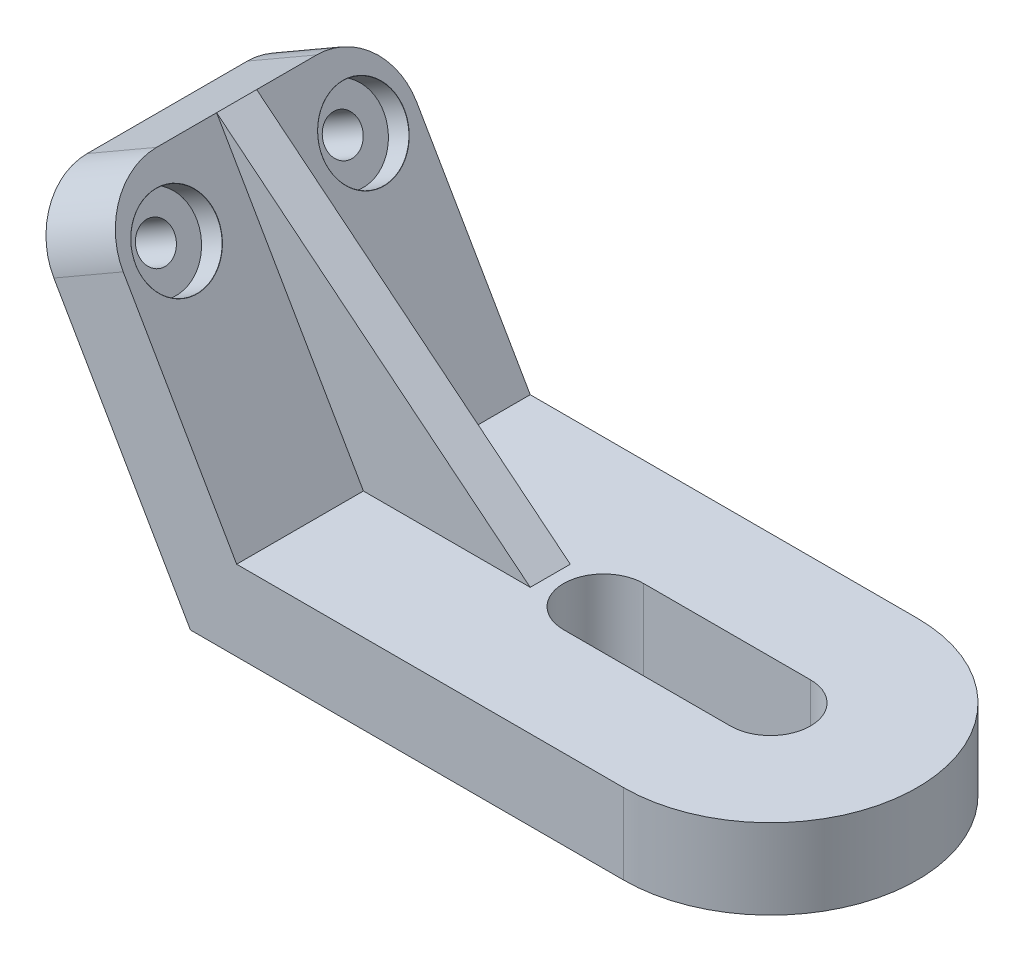
ISO-10303-21;
HEADER;
FILE_DESCRIPTION(('STEP AP214'),'2;1');
FILE_NAME('part.step','',(''),(''),'','','');
FILE_SCHEMA(('AUTOMOTIVE_DESIGN { 1 0 10303 214 1 1 1 1 }'));
ENDSEC;
DATA;
#1=APPLICATION_CONTEXT('core data for automotive mechanical design processes');
#2=APPLICATION_PROTOCOL_DEFINITION('international standard','automotive_design',2000,#1);
#3=PRODUCT_CONTEXT('',#1,'mechanical');
#4=PRODUCT('Part','Part','',(#3));
#5=PRODUCT_RELATED_PRODUCT_CATEGORY('part','',(#4));
#6=PRODUCT_DEFINITION_FORMATION('','',#4);
#7=PRODUCT_DEFINITION_CONTEXT('part definition',#1,'design');
#8=PRODUCT_DEFINITION('design','',#6,#7);
#9=PRODUCT_DEFINITION_SHAPE('','',#8);
#10=(LENGTH_UNIT() NAMED_UNIT(*) SI_UNIT(.MILLI.,.METRE.));
#11=(NAMED_UNIT(*) PLANE_ANGLE_UNIT() SI_UNIT($,.RADIAN.));
#12=(NAMED_UNIT(*) SI_UNIT($,.STERADIAN.) SOLID_ANGLE_UNIT());
#13=UNCERTAINTY_MEASURE_WITH_UNIT(LENGTH_MEASURE(1.E-05),#10,'distance_accuracy_value','');
#14=(GEOMETRIC_REPRESENTATION_CONTEXT(3) GLOBAL_UNCERTAINTY_ASSIGNED_CONTEXT((#13)) GLOBAL_UNIT_ASSIGNED_CONTEXT((#10,
#11,#12)) REPRESENTATION_CONTEXT('',''));
#15=CARTESIAN_POINT('',(0.,0.,0.));
#16=DIRECTION('',(0.,0.,1.));
#17=DIRECTION('',(1.,0.,0.));
#18=AXIS2_PLACEMENT_3D('',#15,#16,#17);
#19=CARTESIAN_POINT('',(-41.920628378231,5.59269971752802,22.));
#20=DIRECTION('',(0.,-1.,0.));
#21=DIRECTION('',(0.,0.,-1.));
#22=AXIS2_PLACEMENT_3D('',#19,#20,#21);
#23=PLANE('',#22);
#24=CARTESIAN_POINT('',(16.079371621769,5.59269971752802,0.));
#25=DIRECTION('',(0.,1.,0.));
#26=DIRECTION('',(0.,0.,1.));
#27=AXIS2_PLACEMENT_3D('',#24,#25,#26);
#28=CIRCLE('',#27,6.);
#29=CARTESIAN_POINT('',(16.079371621769,5.59269971752802,6.));
#30=VERTEX_POINT('',#29);
#31=CARTESIAN_POINT('',(16.079371621769,5.59269971752802,-6.));
#32=VERTEX_POINT('',#31);
#33=EDGE_CURVE('E232',#30,#32,#28,.T.);
#34=ORIENTED_EDGE('',*,*,#33,.F.);
#35=DIRECTION('',(1.,0.,0.));
#36=VECTOR('',#35,1.);
#37=CARTESIAN_POINT('',(0.,5.59269971752802,6.));
#38=LINE('',#37,#36);
#39=CARTESIAN_POINT('',(-8.92062837823097,5.59269971752802,6.));
#40=VERTEX_POINT('',#39);
#41=EDGE_CURVE('E198',#40,#30,#38,.T.);
#42=ORIENTED_EDGE('',*,*,#41,.F.);
#43=CARTESIAN_POINT('',(-8.92062837823097,5.59269971752802,0.));
#44=DIRECTION('',(0.,1.,0.));
#45=DIRECTION('',(0.,0.,1.));
#46=AXIS2_PLACEMENT_3D('',#43,#44,#45);
#47=CIRCLE('',#46,6.);
#48=CARTESIAN_POINT('',(-8.92062837823097,5.59269971752802,-6.));
#49=VERTEX_POINT('',#48);
#50=EDGE_CURVE('E219',#49,#40,#47,.T.);
#51=ORIENTED_EDGE('',*,*,#50,.F.);
#52=DIRECTION('',(1.,0.,0.));
#53=VECTOR('',#52,1.);
#54=CARTESIAN_POINT('',(0.,5.59269971752802,-6.));
#55=LINE('',#54,#53);
#56=EDGE_CURVE('E223',#49,#32,#55,.T.);
#57=ORIENTED_EDGE('',*,*,#56,.T.);
#58=EDGE_LOOP('',(#34,#42,#51,#57));
#59=FACE_BOUND('',#58,.T.);
#60=DIRECTION('',(-1.,0.,0.));
#61=VECTOR('',#60,1.);
#62=CARTESIAN_POINT('',(-41.920628378231,5.59269971752802,22.));
#63=LINE('',#62,#61);
#64=CARTESIAN_POINT('',(16.079371621769,5.59269971752802,22.));
#65=VERTEX_POINT('',#64);
#66=CARTESIAN_POINT('',(-41.920628378231,5.59269971752802,22.));
#67=VERTEX_POINT('',#66);
#68=EDGE_CURVE('E336',#65,#67,#63,.T.);
#69=ORIENTED_EDGE('',*,*,#68,.F.);
#70=CARTESIAN_POINT('',(16.079371621769,5.59269971752802,0.));
#71=DIRECTION('',(0.,1.,0.));
#72=DIRECTION('',(0.,0.,1.));
#73=AXIS2_PLACEMENT_3D('',#70,#71,#72);
#74=CIRCLE('',#73,22.);
#75=CARTESIAN_POINT('',(16.079371621769,5.59269971752802,-22.));
#76=VERTEX_POINT('',#75);
#77=EDGE_CURVE('E250',#65,#76,#74,.T.);
#78=ORIENTED_EDGE('',*,*,#77,.T.);
#79=DIRECTION('',(-1.,0.,0.));
#80=VECTOR('',#79,1.);
#81=CARTESIAN_POINT('',(-41.920628378231,5.59269971752802,-22.));
#82=LINE('',#81,#80);
#83=CARTESIAN_POINT('',(-41.920628378231,5.59269971752802,-22.));
#84=VERTEX_POINT('',#83);
#85=EDGE_CURVE('E329',#76,#84,#82,.T.);
#86=ORIENTED_EDGE('',*,*,#85,.T.);
#87=DIRECTION('',(0.,0.,-1.));
#88=VECTOR('',#87,1.);
#89=CARTESIAN_POINT('',(-41.920628378231,5.59269971752802,22.));
#90=LINE('',#89,#88);
#91=CARTESIAN_POINT('',(-41.920628378231,5.59269971752802,-3.));
#92=VERTEX_POINT('',#91);
#93=EDGE_CURVE('E339',#92,#84,#90,.T.);
#94=ORIENTED_EDGE('',*,*,#93,.F.);
#95=DIRECTION('',(1.,0.,0.));
#96=VECTOR('',#95,1.);
#97=CARTESIAN_POINT('',(-41.920628378231,5.59269971752802,-3.));
#98=LINE('',#97,#96);
#99=CARTESIAN_POINT('',(-16.920628378231,5.59269971752802,-3.));
#100=VERTEX_POINT('',#99);
#101=EDGE_CURVE('E266',#92,#100,#98,.T.);
#102=ORIENTED_EDGE('',*,*,#101,.T.);
#103=DIRECTION('',(0.,0.,-1.));
#104=VECTOR('',#103,1.);
#105=CARTESIAN_POINT('',(-16.920628378231,5.59269971752802,3.));
#106=LINE('',#105,#104);
#107=CARTESIAN_POINT('',(-16.920628378231,5.59269971752802,3.));
#108=VERTEX_POINT('',#107);
#109=EDGE_CURVE('E272',#108,#100,#106,.T.);
#110=ORIENTED_EDGE('',*,*,#109,.F.);
#111=DIRECTION('',(1.,0.,0.));
#112=VECTOR('',#111,1.);
#113=CARTESIAN_POINT('',(-41.920628378231,5.59269971752802,3.));
#114=LINE('',#113,#112);
#115=CARTESIAN_POINT('',(-41.920628378231,5.59269971752802,3.));
#116=VERTEX_POINT('',#115);
#117=EDGE_CURVE('E269',#116,#108,#114,.T.);
#118=ORIENTED_EDGE('',*,*,#117,.F.);
#119=EDGE_CURVE('E352',#67,#116,#90,.T.);
#120=ORIENTED_EDGE('',*,*,#119,.F.);
#121=EDGE_LOOP('',(#69,#78,#86,#94,#102,#110,#118,#120));
#122=FACE_BOUND('',#121,.T.);
#123=ADVANCED_FACE('F84',(#59,#122),#23,.F.);
#124=CARTESIAN_POINT('',(38.079371621769,-6.40730028247198,22.));
#125=DIRECTION('',(0.,1.,0.));
#126=DIRECTION('',(-1.,0.,0.));
#127=AXIS2_PLACEMENT_3D('',#124,#125,#126);
#128=PLANE('',#127);
#129=CARTESIAN_POINT('',(-8.92062837823097,-6.407300282472,0.));
#130=DIRECTION('',(0.,1.,0.));
#131=DIRECTION('',(0.,0.,1.));
#132=AXIS2_PLACEMENT_3D('',#129,#130,#131);
#133=CIRCLE('',#132,6.);
#134=CARTESIAN_POINT('',(-8.92062837823097,-6.407300282472,-6.));
#135=VERTEX_POINT('',#134);
#136=CARTESIAN_POINT('',(-8.92062837823097,-6.407300282472,6.));
#137=VERTEX_POINT('',#136);
#138=EDGE_CURVE('E204',#135,#137,#133,.T.);
#139=ORIENTED_EDGE('',*,*,#138,.T.);
#140=DIRECTION('',(1.,0.,0.));
#141=VECTOR('',#140,1.);
#142=CARTESIAN_POINT('',(0.,-6.407300282472,6.));
#143=LINE('',#142,#141);
#144=CARTESIAN_POINT('',(16.079371621769,-6.407300282472,6.));
#145=VERTEX_POINT('',#144);
#146=EDGE_CURVE('E195',#137,#145,#143,.T.);
#147=ORIENTED_EDGE('',*,*,#146,.T.);
#148=CARTESIAN_POINT('',(16.079371621769,-6.407300282472,0.));
#149=DIRECTION('',(0.,1.,0.));
#150=DIRECTION('',(0.,0.,1.));
#151=AXIS2_PLACEMENT_3D('',#148,#149,#150);
#152=CIRCLE('',#151,6.);
#153=CARTESIAN_POINT('',(16.079371621769,-6.40730028247199,-6.));
#154=VERTEX_POINT('',#153);
#155=EDGE_CURVE('E207',#145,#154,#152,.T.);
#156=ORIENTED_EDGE('',*,*,#155,.T.);
#157=DIRECTION('',(1.,0.,0.));
#158=VECTOR('',#157,1.);
#159=CARTESIAN_POINT('',(0.,-6.407300282472,-6.));
#160=LINE('',#159,#158);
#161=EDGE_CURVE('E213',#135,#154,#160,.T.);
#162=ORIENTED_EDGE('',*,*,#161,.F.);
#163=EDGE_LOOP('',(#139,#147,#156,#162));
#164=FACE_BOUND('',#163,.T.);
#165=CARTESIAN_POINT('',(16.079371621769,-6.407300282472,0.));
#166=DIRECTION('',(0.,1.,0.));
#167=DIRECTION('',(0.,0.,1.));
#168=AXIS2_PLACEMENT_3D('',#165,#166,#167);
#169=CIRCLE('',#168,22.);
#170=CARTESIAN_POINT('',(16.079371621769,-6.407300282472,22.));
#171=VERTEX_POINT('',#170);
#172=CARTESIAN_POINT('',(16.079371621769,-6.40730028247199,-22.));
#173=VERTEX_POINT('',#172);
#174=EDGE_CURVE('E251',#171,#173,#169,.T.);
#175=ORIENTED_EDGE('',*,*,#174,.F.);
#176=DIRECTION('',(1.,0.,0.));
#177=VECTOR('',#176,1.);
#178=CARTESIAN_POINT('',(38.079371621769,-6.40730028247198,22.));
#179=LINE('',#178,#177);
#180=CARTESIAN_POINT('',(-48.8488316085065,-6.40730028247199,22.));
#181=VERTEX_POINT('',#180);
#182=EDGE_CURVE('E332',#181,#171,#179,.T.);
#183=ORIENTED_EDGE('',*,*,#182,.F.);
#184=DIRECTION('',(0.,0.,-1.));
#185=VECTOR('',#184,1.);
#186=CARTESIAN_POINT('',(-48.8488316085065,-6.40730028247199,22.));
#187=LINE('',#186,#185);
#188=CARTESIAN_POINT('',(-48.8488316085065,-6.40730028247199,-22.));
#189=VERTEX_POINT('',#188);
#190=EDGE_CURVE('E356',#181,#189,#187,.T.);
#191=ORIENTED_EDGE('',*,*,#190,.T.);
#192=DIRECTION('',(1.,0.,0.));
#193=VECTOR('',#192,1.);
#194=CARTESIAN_POINT('',(38.079371621769,-6.40730028247198,-22.));
#195=LINE('',#194,#193);
#196=EDGE_CURVE('E346',#189,#173,#195,.T.);
#197=ORIENTED_EDGE('',*,*,#196,.T.);
#198=EDGE_LOOP('',(#175,#183,#191,#197));
#199=FACE_BOUND('',#198,.T.);
#200=ADVANCED_FACE('F215',(#164,#199),#128,.F.);
#201=CARTESIAN_POINT('',(0.,0.,22.));
#202=DIRECTION('',(0.,0.,1.));
#203=DIRECTION('',(1.,0.,0.));
#204=AXIS2_PLACEMENT_3D('',#201,#202,#203);
#205=PLANE('',#204);
#206=DIRECTION('',(-0.499999999999998,0.86602540378444,0.));
#207=VECTOR('',#206,1.);
#208=CARTESIAN_POINT('',(-41.920628378231,5.59269971752802,22.));
#209=LINE('',#208,#207);
#210=CARTESIAN_POINT('',(-58.9206283782309,35.037563446199,22.));
#211=VERTEX_POINT('',#210);
#212=EDGE_CURVE('E324',#67,#211,#209,.T.);
#213=ORIENTED_EDGE('',*,*,#212,.T.);
#214=DIRECTION('',(-0.866025403784439,-0.499999999999999,0.));
#215=VECTOR('',#214,1.);
#216=CARTESIAN_POINT('',(-69.3129332236442,29.037563446199,22.));
#217=LINE('',#216,#215);
#218=CARTESIAN_POINT('',(-69.3129332236442,29.037563446199,22.));
#219=VERTEX_POINT('',#218);
#220=EDGE_CURVE('E367',#211,#219,#217,.T.);
#221=ORIENTED_EDGE('',*,*,#220,.T.);
#222=DIRECTION('',(0.499999999999999,-0.866025403784439,0.));
#223=VECTOR('',#222,1.);
#224=CARTESIAN_POINT('',(-48.8488316085065,-6.40730028247199,22.));
#225=LINE('',#224,#223);
#226=EDGE_CURVE('E328',#219,#181,#225,.T.);
#227=ORIENTED_EDGE('',*,*,#226,.T.);
#228=ORIENTED_EDGE('',*,*,#182,.T.);
#229=DIRECTION('',(0.,1.,0.));
#230=VECTOR('',#229,1.);
#231=CARTESIAN_POINT('',(16.079371621769,-6.407300282472,22.));
#232=LINE('',#231,#230);
#233=EDGE_CURVE('E241',#171,#65,#232,.T.);
#234=ORIENTED_EDGE('',*,*,#233,.T.);
#235=ORIENTED_EDGE('',*,*,#68,.T.);
#236=EDGE_LOOP('',(#213,#221,#227,#228,#234,#235));
#237=FACE_BOUND('',#236,.T.);
#238=ADVANCED_FACE('F412',(#237),#205,.T.);
#239=CARTESIAN_POINT('',(0.,0.,-22.));
#240=DIRECTION('',(0.,0.,1.));
#241=DIRECTION('',(1.,0.,0.));
#242=AXIS2_PLACEMENT_3D('',#239,#240,#241);
#243=PLANE('',#242);
#244=DIRECTION('',(0.499999999999999,-0.866025403784439,0.));
#245=VECTOR('',#244,1.);
#246=CARTESIAN_POINT('',(-48.8488316085065,-6.40730028247199,-22.));
#247=LINE('',#246,#245);
#248=CARTESIAN_POINT('',(-69.3129332236442,29.037563446199,-22.));
#249=VERTEX_POINT('',#248);
#250=EDGE_CURVE('E343',#249,#189,#247,.T.);
#251=ORIENTED_EDGE('',*,*,#250,.F.);
#252=DIRECTION('',(-0.866025403784439,-0.499999999999999,0.));
#253=VECTOR('',#252,1.);
#254=CARTESIAN_POINT('',(-29.9018671101163,51.7915530758944,-22.));
#255=LINE('',#254,#253);
#256=CARTESIAN_POINT('',(-58.9206283782309,35.037563446199,-22.));
#257=VERTEX_POINT('',#256);
#258=EDGE_CURVE('E93',#249,#257,#255,.F.);
#259=ORIENTED_EDGE('',*,*,#258,.T.);
#260=DIRECTION('',(-0.499999999999998,0.86602540378444,0.));
#261=VECTOR('',#260,1.);
#262=CARTESIAN_POINT('',(-41.920628378231,5.59269971752802,-22.));
#263=LINE('',#262,#261);
#264=EDGE_CURVE('E340',#84,#257,#263,.T.);
#265=ORIENTED_EDGE('',*,*,#264,.F.);
#266=ORIENTED_EDGE('',*,*,#85,.F.);
#267=DIRECTION('',(0.,1.,0.));
#268=VECTOR('',#267,1.);
#269=CARTESIAN_POINT('',(16.079371621769,-6.407300282472,-22.));
#270=LINE('',#269,#268);
#271=EDGE_CURVE('E254',#173,#76,#270,.T.);
#272=ORIENTED_EDGE('',*,*,#271,.F.);
#273=ORIENTED_EDGE('',*,*,#196,.F.);
#274=EDGE_LOOP('',(#251,#259,#265,#266,#272,#273));
#275=FACE_BOUND('',#274,.T.);
#276=ADVANCED_FACE('F403',(#275),#243,.F.);
#277=CARTESIAN_POINT('',(-41.920628378231,5.59269971752802,22.));
#278=DIRECTION('',(-0.86602540378444,-0.499999999999998,0.));
#279=DIRECTION('',(0.499999999999998,-0.86602540378444,0.));
#280=AXIS2_PLACEMENT_3D('',#277,#278,#279);
#281=PLANE('',#280);
#282=CARTESIAN_POINT('',(-58.9206283782309,35.037563446199,14.));
#283=DIRECTION('',(0.86602540378444,0.499999999999998,0.));
#284=DIRECTION('',(-0.499999999999998,0.86602540378444,0.));
#285=AXIS2_PLACEMENT_3D('',#282,#283,#284);
#286=CIRCLE('',#285,6.144);
#287=CARTESIAN_POINT('',(-61.9926283782309,40.3584235270506,14.));
#288=VERTEX_POINT('',#287);
#289=EDGE_CURVE('E307',#288,#288,#286,.T.);
#290=ORIENTED_EDGE('',*,*,#289,.F.);
#291=EDGE_LOOP('',(#290));
#292=FACE_BOUND('',#291,.T.);
#293=DIRECTION('',(0.,0.,-1.));
#294=VECTOR('',#293,1.);
#295=CARTESIAN_POINT('',(-63.9206283782309,43.6978174840434,22.));
#296=LINE('',#295,#294);
#297=CARTESIAN_POINT('',(-63.9206283782309,43.6978174840434,12.));
#298=VERTEX_POINT('',#297);
#299=CARTESIAN_POINT('',(-63.9206283782309,43.6978174840434,3.));
#300=VERTEX_POINT('',#299);
#301=EDGE_CURVE('E364',#298,#300,#296,.T.);
#302=ORIENTED_EDGE('',*,*,#301,.F.);
#303=CARTESIAN_POINT('',(-58.9206283782309,35.037563446199,12.));
#304=DIRECTION('',(-0.86602540378444,-0.499999999999998,0.));
#305=DIRECTION('',(0.499999999999998,-0.86602540378444,0.));
#306=AXIS2_PLACEMENT_3D('',#303,#304,#305);
#307=CIRCLE('',#306,10.);
#308=EDGE_CURVE('E383',#298,#211,#307,.F.);
#309=ORIENTED_EDGE('',*,*,#308,.T.);
#310=ORIENTED_EDGE('',*,*,#212,.F.);
#311=ORIENTED_EDGE('',*,*,#119,.T.);
#312=DIRECTION('',(0.499999999999998,-0.86602540378444,0.));
#313=VECTOR('',#312,1.);
#314=CARTESIAN_POINT('',(-63.9206283782309,43.6978174840434,3.));
#315=LINE('',#314,#313);
#316=EDGE_CURVE('E265',#300,#116,#315,.T.);
#317=ORIENTED_EDGE('',*,*,#316,.F.);
#318=EDGE_LOOP('',(#302,#309,#310,#311,#317));
#319=FACE_BOUND('',#318,.T.);
#320=ADVANCED_FACE('F429',(#292,#319),#281,.F.);
#321=CARTESIAN_POINT('',(-58.9206283782309,35.037563446199,-14.));
#322=DIRECTION('',(0.86602540378444,0.499999999999998,0.));
#323=DIRECTION('',(-0.499999999999998,0.86602540378444,0.));
#324=AXIS2_PLACEMENT_3D('',#321,#322,#323);
#325=CIRCLE('',#324,6.144);
#326=CARTESIAN_POINT('',(-61.9926283782309,40.3584235270506,-14.));
#327=VERTEX_POINT('',#326);
#328=EDGE_CURVE('E290',#327,#327,#325,.T.);
#329=ORIENTED_EDGE('',*,*,#328,.F.);
#330=EDGE_LOOP('',(#329));
#331=FACE_BOUND('',#330,.T.);
#332=ORIENTED_EDGE('',*,*,#264,.T.);
#333=CARTESIAN_POINT('',(-58.9206283782309,35.037563446199,-12.));
#334=DIRECTION('',(-0.86602540378444,-0.499999999999998,0.));
#335=DIRECTION('',(0.499999999999998,-0.86602540378444,0.));
#336=AXIS2_PLACEMENT_3D('',#333,#334,#335);
#337=CIRCLE('',#336,10.);
#338=CARTESIAN_POINT('',(-63.9206283782309,43.6978174840434,-12.));
#339=VERTEX_POINT('',#338);
#340=EDGE_CURVE('E12',#257,#339,#337,.F.);
#341=ORIENTED_EDGE('',*,*,#340,.T.);
#342=CARTESIAN_POINT('',(-63.9206283782309,43.6978174840434,-3.));
#343=VERTEX_POINT('',#342);
#344=EDGE_CURVE('E363',#343,#339,#296,.T.);
#345=ORIENTED_EDGE('',*,*,#344,.F.);
#346=DIRECTION('',(0.499999999999998,-0.86602540378444,0.));
#347=VECTOR('',#346,1.);
#348=CARTESIAN_POINT('',(-63.9206283782309,43.6978174840434,-3.));
#349=LINE('',#348,#347);
#350=EDGE_CURVE('E276',#343,#92,#349,.T.);
#351=ORIENTED_EDGE('',*,*,#350,.T.);
#352=ORIENTED_EDGE('',*,*,#93,.T.);
#353=EDGE_LOOP('',(#332,#341,#345,#351,#352));
#354=FACE_BOUND('',#353,.T.);
#355=ADVANCED_FACE('F398',(#331,#354),#281,.F.);
#356=CARTESIAN_POINT('',(-63.9206283782309,43.6978174840434,22.));
#357=DIRECTION('',(0.499999999999999,-0.866025403784439,0.));
#358=DIRECTION('',(0.866025403784439,0.499999999999999,0.));
#359=AXIS2_PLACEMENT_3D('',#356,#357,#358);
#360=PLANE('',#359);
#361=ORIENTED_EDGE('',*,*,#344,.T.);
#362=DIRECTION('',(-0.866025403784439,-0.499999999999999,0.));
#363=VECTOR('',#362,1.);
#364=CARTESIAN_POINT('',(-63.9206283782309,43.6978174840434,-12.));
#365=LINE('',#364,#363);
#366=CARTESIAN_POINT('',(-74.3129332236442,37.6978174840434,-12.));
#367=VERTEX_POINT('',#366);
#368=EDGE_CURVE('E386',#339,#367,#365,.T.);
#369=ORIENTED_EDGE('',*,*,#368,.T.);
#370=DIRECTION('',(0.,0.,-1.));
#371=VECTOR('',#370,1.);
#372=CARTESIAN_POINT('',(-74.3129332236442,37.6978174840434,22.));
#373=LINE('',#372,#371);
#374=CARTESIAN_POINT('',(-74.3129332236442,37.6978174840434,12.));
#375=VERTEX_POINT('',#374);
#376=EDGE_CURVE('E360',#375,#367,#373,.T.);
#377=ORIENTED_EDGE('',*,*,#376,.F.);
#378=DIRECTION('',(-0.866025403784439,-0.499999999999999,0.));
#379=VECTOR('',#378,1.);
#380=CARTESIAN_POINT('',(-63.9206283782309,43.6978174840434,12.));
#381=LINE('',#380,#379);
#382=EDGE_CURVE('E380',#375,#298,#381,.F.);
#383=ORIENTED_EDGE('',*,*,#382,.T.);
#384=ORIENTED_EDGE('',*,*,#301,.T.);
#385=DIRECTION('',(0.,0.,-1.));
#386=VECTOR('',#385,1.);
#387=CARTESIAN_POINT('',(-63.9206283782309,43.6978174840434,3.));
#388=LINE('',#387,#386);
#389=EDGE_CURVE('E286',#300,#343,#388,.T.);
#390=ORIENTED_EDGE('',*,*,#389,.T.);
#391=EDGE_LOOP('',(#361,#369,#377,#383,#384,#390));
#392=FACE_BOUND('',#391,.T.);
#393=ADVANCED_FACE('F419',(#392),#360,.F.);
#394=CARTESIAN_POINT('',(-48.8488316085065,-6.40730028247199,22.));
#395=DIRECTION('',(0.86602540378444,0.499999999999999,0.));
#396=DIRECTION('',(-0.499999999999999,0.86602540378444,0.));
#397=AXIS2_PLACEMENT_3D('',#394,#395,#396);
#398=PLANE('',#397);
#399=CARTESIAN_POINT('',(-69.3129332236442,29.037563446199,-14.));
#400=DIRECTION('',(0.86602540378444,0.499999999999999,0.));
#401=DIRECTION('',(-0.499999999999999,0.86602540378444,0.));
#402=AXIS2_PLACEMENT_3D('',#399,#400,#401);
#403=CIRCLE('',#402,2.75);
#404=CARTESIAN_POINT('',(-70.6879332236442,31.4191333066062,-14.));
#405=VERTEX_POINT('',#404);
#406=EDGE_CURVE('E306',#405,#405,#403,.T.);
#407=ORIENTED_EDGE('',*,*,#406,.T.);
#408=EDGE_LOOP('',(#407));
#409=FACE_BOUND('',#408,.T.);
#410=CARTESIAN_POINT('',(-69.3129332236442,29.037563446199,14.));
#411=DIRECTION('',(0.86602540378444,0.499999999999999,0.));
#412=DIRECTION('',(-0.499999999999999,0.86602540378444,0.));
#413=AXIS2_PLACEMENT_3D('',#410,#411,#412);
#414=CIRCLE('',#413,2.75);
#415=CARTESIAN_POINT('',(-70.6879332236442,31.4191333066062,14.));
#416=VERTEX_POINT('',#415);
#417=EDGE_CURVE('E323',#416,#416,#414,.T.);
#418=ORIENTED_EDGE('',*,*,#417,.T.);
#419=EDGE_LOOP('',(#418));
#420=FACE_BOUND('',#419,.T.);
#421=ORIENTED_EDGE('',*,*,#376,.T.);
#422=CARTESIAN_POINT('',(-69.3129332236442,29.037563446199,-12.));
#423=DIRECTION('',(0.86602540378444,0.499999999999999,0.));
#424=DIRECTION('',(-0.499999999999999,0.86602540378444,0.));
#425=AXIS2_PLACEMENT_3D('',#422,#423,#424);
#426=CIRCLE('',#425,10.);
#427=EDGE_CURVE('E107',#367,#249,#426,.F.);
#428=ORIENTED_EDGE('',*,*,#427,.T.);
#429=ORIENTED_EDGE('',*,*,#250,.T.);
#430=ORIENTED_EDGE('',*,*,#190,.F.);
#431=ORIENTED_EDGE('',*,*,#226,.F.);
#432=CARTESIAN_POINT('',(-69.3129332236442,29.037563446199,12.));
#433=DIRECTION('',(0.86602540378444,0.499999999999999,0.));
#434=DIRECTION('',(-0.499999999999999,0.86602540378444,0.));
#435=AXIS2_PLACEMENT_3D('',#432,#433,#434);
#436=CIRCLE('',#435,10.);
#437=EDGE_CURVE('E377',#219,#375,#436,.F.);
#438=ORIENTED_EDGE('',*,*,#437,.T.);
#439=EDGE_LOOP('',(#421,#428,#429,#430,#431,#438));
#440=FACE_BOUND('',#439,.T.);
#441=ADVANCED_FACE('F457',(#409,#420,#440),#398,.F.);
#442=CARTESIAN_POINT('',(-58.9206283782309,35.037563446199,14.));
#443=DIRECTION('',(0.86602540378444,0.499999999999998,0.));
#444=DIRECTION('',(-0.499999999999998,0.86602540378444,0.));
#445=AXIS2_PLACEMENT_3D('',#442,#443,#444);
#446=CYLINDRICAL_SURFACE('',#445,2.75);
#447=CARTESIAN_POINT('',(-62.0209993237792,33.247563446199,14.));
#448=DIRECTION('',(0.86602540378444,0.499999999999998,0.));
#449=DIRECTION('',(-0.499999999999998,0.86602540378444,0.));
#450=AXIS2_PLACEMENT_3D('',#447,#448,#449);
#451=CIRCLE('',#450,2.75);
#452=CARTESIAN_POINT('',(-63.3959993237792,35.6291333066062,14.));
#453=VERTEX_POINT('',#452);
#454=EDGE_CURVE('E319',#453,#453,#451,.T.);
#455=ORIENTED_EDGE('',*,*,#454,.T.);
#456=EDGE_LOOP('',(#455));
#457=FACE_BOUND('',#456,.T.);
#458=ORIENTED_EDGE('',*,*,#417,.F.);
#459=EDGE_LOOP('',(#458));
#460=FACE_BOUND('',#459,.T.);
#461=ADVANCED_FACE('F460',(#457,#460),#446,.F.);
#462=CARTESIAN_POINT('',(-62.0209993237792,33.247563446199,20.12));
#463=DIRECTION('',(-0.86602540378444,-0.499999999999998,0.));
#464=DIRECTION('',(0.499999999999998,-0.86602540378444,0.));
#465=AXIS2_PLACEMENT_3D('',#462,#463,#464);
#466=PLANE('',#465);
#467=ORIENTED_EDGE('',*,*,#454,.F.);
#468=EDGE_LOOP('',(#467));
#469=FACE_BOUND('',#468,.T.);
#470=CARTESIAN_POINT('',(-62.0209993237792,33.247563446199,14.));
#471=DIRECTION('',(0.86602540378444,0.499999999999998,0.));
#472=DIRECTION('',(-0.499999999999998,0.86602540378444,0.));
#473=AXIS2_PLACEMENT_3D('',#470,#471,#472);
#474=CIRCLE('',#473,6.12);
#475=CARTESIAN_POINT('',(-65.0809993237792,38.5476389173598,14.));
#476=VERTEX_POINT('',#475);
#477=EDGE_CURVE('E315',#476,#476,#474,.T.);
#478=ORIENTED_EDGE('',*,*,#477,.T.);
#479=EDGE_LOOP('',(#478));
#480=FACE_BOUND('',#479,.T.);
#481=ADVANCED_FACE('F676',(#469,#480),#466,.F.);
#482=CARTESIAN_POINT('',(-58.9206283782309,35.037563446199,14.));
#483=DIRECTION('',(0.86602540378444,0.499999999999998,0.));
#484=DIRECTION('',(-0.499999999999998,0.86602540378444,0.));
#485=AXIS2_PLACEMENT_3D('',#482,#483,#484);
#486=CYLINDRICAL_SURFACE('',#485,6.12);
#487=ORIENTED_EDGE('',*,*,#477,.F.);
#488=EDGE_LOOP('',(#487));
#489=FACE_BOUND('',#488,.T.);
#490=CARTESIAN_POINT('',(-58.9414129879217,35.025563446199,14.));
#491=DIRECTION('',(0.86602540378444,0.499999999999998,0.));
#492=DIRECTION('',(-0.499999999999998,0.86602540378444,0.));
#493=AXIS2_PLACEMENT_3D('',#490,#491,#492);
#494=CIRCLE('',#493,6.12);
#495=CARTESIAN_POINT('',(-62.0014129879217,40.3256389173597,14.));
#496=VERTEX_POINT('',#495);
#497=EDGE_CURVE('E311',#496,#496,#494,.T.);
#498=ORIENTED_EDGE('',*,*,#497,.T.);
#499=EDGE_LOOP('',(#498));
#500=FACE_BOUND('',#499,.T.);
#501=ADVANCED_FACE('F665',(#489,#500),#486,.F.);
#502=CARTESIAN_POINT('',(-58.9206283782309,35.037563446199,14.));
#503=DIRECTION('',(0.86602540378444,0.499999999999998,0.));
#504=DIRECTION('',(-0.499999999999998,0.86602540378444,0.));
#505=AXIS2_PLACEMENT_3D('',#502,#503,#504);
#506=CONICAL_SURFACE('',#505,6.144,0.785398163397427);
#507=ORIENTED_EDGE('',*,*,#497,.F.);
#508=EDGE_LOOP('',(#507));
#509=FACE_BOUND('',#508,.T.);
#510=ORIENTED_EDGE('',*,*,#289,.T.);
#511=EDGE_LOOP('',(#510));
#512=FACE_BOUND('',#511,.T.);
#513=ADVANCED_FACE('F654',(#509,#512),#506,.F.);
#514=CARTESIAN_POINT('',(-58.9206283782309,35.037563446199,-14.));
#515=DIRECTION('',(0.86602540378444,0.499999999999998,0.));
#516=DIRECTION('',(-0.499999999999998,0.86602540378444,0.));
#517=AXIS2_PLACEMENT_3D('',#514,#515,#516);
#518=CYLINDRICAL_SURFACE('',#517,2.75);
#519=CARTESIAN_POINT('',(-62.0209993237792,33.247563446199,-14.));
#520=DIRECTION('',(0.86602540378444,0.499999999999998,0.));
#521=DIRECTION('',(-0.499999999999998,0.86602540378444,0.));
#522=AXIS2_PLACEMENT_3D('',#519,#520,#521);
#523=CIRCLE('',#522,2.75);
#524=CARTESIAN_POINT('',(-63.3959993237792,35.6291333066062,-14.));
#525=VERTEX_POINT('',#524);
#526=EDGE_CURVE('E302',#525,#525,#523,.T.);
#527=ORIENTED_EDGE('',*,*,#526,.T.);
#528=EDGE_LOOP('',(#527));
#529=FACE_BOUND('',#528,.T.);
#530=ORIENTED_EDGE('',*,*,#406,.F.);
#531=EDGE_LOOP('',(#530));
#532=FACE_BOUND('',#531,.T.);
#533=ADVANCED_FACE('F643',(#529,#532),#518,.F.);
#534=CARTESIAN_POINT('',(-62.0209993237792,33.247563446199,-7.88));
#535=DIRECTION('',(-0.86602540378444,-0.499999999999998,0.));
#536=DIRECTION('',(0.499999999999998,-0.86602540378444,0.));
#537=AXIS2_PLACEMENT_3D('',#534,#535,#536);
#538=PLANE('',#537);
#539=ORIENTED_EDGE('',*,*,#526,.F.);
#540=EDGE_LOOP('',(#539));
#541=FACE_BOUND('',#540,.T.);
#542=CARTESIAN_POINT('',(-62.0209993237792,33.247563446199,-14.));
#543=DIRECTION('',(0.86602540378444,0.499999999999998,0.));
#544=DIRECTION('',(-0.499999999999998,0.86602540378444,0.));
#545=AXIS2_PLACEMENT_3D('',#542,#543,#544);
#546=CIRCLE('',#545,6.12);
#547=CARTESIAN_POINT('',(-65.0809993237792,38.5476389173598,-14.));
#548=VERTEX_POINT('',#547);
#549=EDGE_CURVE('E298',#548,#548,#546,.T.);
#550=ORIENTED_EDGE('',*,*,#549,.T.);
#551=EDGE_LOOP('',(#550));
#552=FACE_BOUND('',#551,.T.);
#553=ADVANCED_FACE('F632',(#541,#552),#538,.F.);
#554=CARTESIAN_POINT('',(-58.9206283782309,35.037563446199,-14.));
#555=DIRECTION('',(0.86602540378444,0.499999999999998,0.));
#556=DIRECTION('',(-0.499999999999998,0.86602540378444,0.));
#557=AXIS2_PLACEMENT_3D('',#554,#555,#556);
#558=CYLINDRICAL_SURFACE('',#557,6.12);
#559=ORIENTED_EDGE('',*,*,#549,.F.);
#560=EDGE_LOOP('',(#559));
#561=FACE_BOUND('',#560,.T.);
#562=CARTESIAN_POINT('',(-58.9414129879217,35.025563446199,-14.));
#563=DIRECTION('',(0.86602540378444,0.499999999999998,0.));
#564=DIRECTION('',(-0.499999999999998,0.86602540378444,0.));
#565=AXIS2_PLACEMENT_3D('',#562,#563,#564);
#566=CIRCLE('',#565,6.12);
#567=CARTESIAN_POINT('',(-62.0014129879217,40.3256389173597,-14.));
#568=VERTEX_POINT('',#567);
#569=EDGE_CURVE('E294',#568,#568,#566,.T.);
#570=ORIENTED_EDGE('',*,*,#569,.T.);
#571=EDGE_LOOP('',(#570));
#572=FACE_BOUND('',#571,.T.);
#573=ADVANCED_FACE('F621',(#561,#572),#558,.F.);
#574=CARTESIAN_POINT('',(-58.9206283782309,35.037563446199,-14.));
#575=DIRECTION('',(0.86602540378444,0.499999999999998,0.));
#576=DIRECTION('',(-0.499999999999998,0.86602540378444,0.));
#577=AXIS2_PLACEMENT_3D('',#574,#575,#576);
#578=CONICAL_SURFACE('',#577,6.144,0.785398163397463);
#579=ORIENTED_EDGE('',*,*,#569,.F.);
#580=EDGE_LOOP('',(#579));
#581=FACE_BOUND('',#580,.T.);
#582=ORIENTED_EDGE('',*,*,#328,.T.);
#583=EDGE_LOOP('',(#582));
#584=FACE_BOUND('',#583,.T.);
#585=ADVANCED_FACE('F607',(#581,#584),#578,.F.);
#586=CARTESIAN_POINT('',(-16.920628378231,5.59269971752802,3.));
#587=DIRECTION('',(-0.629772139175881,-0.776779925537366,0.));
#588=DIRECTION('',(0.776779925537366,-0.629772139175881,0.));
#589=AXIS2_PLACEMENT_3D('',#586,#587,#588);
#590=PLANE('',#589);
#591=DIRECTION('',(-0.776779925537366,0.629772139175881,0.));
#592=VECTOR('',#591,1.);
#593=CARTESIAN_POINT('',(-16.920628378231,5.59269971752802,-3.));
#594=LINE('',#593,#592);
#595=EDGE_CURVE('E260',#100,#343,#594,.T.);
#596=ORIENTED_EDGE('',*,*,#595,.T.);
#597=ORIENTED_EDGE('',*,*,#389,.F.);
#598=DIRECTION('',(-0.776779925537366,0.629772139175881,0.));
#599=VECTOR('',#598,1.);
#600=CARTESIAN_POINT('',(-16.920628378231,5.59269971752802,3.));
#601=LINE('',#600,#599);
#602=EDGE_CURVE('E261',#108,#300,#601,.T.);
#603=ORIENTED_EDGE('',*,*,#602,.F.);
#604=ORIENTED_EDGE('',*,*,#109,.T.);
#605=EDGE_LOOP('',(#596,#597,#603,#604));
#606=FACE_BOUND('',#605,.T.);
#607=ADVANCED_FACE('F426',(#606),#590,.F.);
#608=CARTESIAN_POINT('',(0.,0.,3.));
#609=DIRECTION('',(0.,0.,-1.));
#610=DIRECTION('',(-1.,0.,0.));
#611=AXIS2_PLACEMENT_3D('',#608,#609,#610);
#612=PLANE('',#611);
#613=ORIENTED_EDGE('',*,*,#602,.T.);
#614=ORIENTED_EDGE('',*,*,#316,.T.);
#615=ORIENTED_EDGE('',*,*,#117,.T.);
#616=EDGE_LOOP('',(#613,#614,#615));
#617=FACE_BOUND('',#616,.T.);
#618=ADVANCED_FACE('F434',(#617),#612,.F.);
#619=CARTESIAN_POINT('',(0.,0.,-3.));
#620=DIRECTION('',(0.,0.,-1.));
#621=DIRECTION('',(-1.,0.,0.));
#622=AXIS2_PLACEMENT_3D('',#619,#620,#621);
#623=PLANE('',#622);
#624=ORIENTED_EDGE('',*,*,#595,.F.);
#625=ORIENTED_EDGE('',*,*,#101,.F.);
#626=ORIENTED_EDGE('',*,*,#350,.F.);
#627=EDGE_LOOP('',(#624,#625,#626));
#628=FACE_BOUND('',#627,.T.);
#629=ADVANCED_FACE('F436',(#628),#623,.T.);
#630=CARTESIAN_POINT('',(16.079371621769,-6.407300282472,0.));
#631=DIRECTION('',(0.,1.,0.));
#632=DIRECTION('',(0.,0.,1.));
#633=AXIS2_PLACEMENT_3D('',#630,#631,#632);
#634=CYLINDRICAL_SURFACE('',#633,22.);
#635=ORIENTED_EDGE('',*,*,#77,.F.);
#636=ORIENTED_EDGE('',*,*,#233,.F.);
#637=ORIENTED_EDGE('',*,*,#174,.T.);
#638=ORIENTED_EDGE('',*,*,#271,.T.);
#639=EDGE_LOOP('',(#635,#636,#637,#638));
#640=FACE_BOUND('',#639,.T.);
#641=ADVANCED_FACE('F410',(#640),#634,.T.);
#642=CARTESIAN_POINT('',(0.,-6.407300282472,6.));
#643=DIRECTION('',(0.,0.,1.));
#644=DIRECTION('',(1.,0.,0.));
#645=AXIS2_PLACEMENT_3D('',#642,#643,#644);
#646=PLANE('',#645);
#647=ORIENTED_EDGE('',*,*,#41,.T.);
#648=DIRECTION('',(0.,1.,0.));
#649=VECTOR('',#648,1.);
#650=CARTESIAN_POINT('',(16.079371621769,-6.407300282472,6.));
#651=LINE('',#650,#649);
#652=EDGE_CURVE('E191',#145,#30,#651,.T.);
#653=ORIENTED_EDGE('',*,*,#652,.F.);
#654=ORIENTED_EDGE('',*,*,#146,.F.);
#655=DIRECTION('',(0.,1.,0.));
#656=VECTOR('',#655,1.);
#657=CARTESIAN_POINT('',(-8.92062837823097,-6.407300282472,6.));
#658=LINE('',#657,#656);
#659=EDGE_CURVE('E238',#137,#40,#658,.T.);
#660=ORIENTED_EDGE('',*,*,#659,.T.);
#661=EDGE_LOOP('',(#647,#653,#654,#660));
#662=FACE_BOUND('',#661,.T.);
#663=ADVANCED_FACE('F193',(#662),#646,.F.);
#664=CARTESIAN_POINT('',(-8.92062837823097,-6.407300282472,0.));
#665=DIRECTION('',(0.,1.,0.));
#666=DIRECTION('',(0.,0.,1.));
#667=AXIS2_PLACEMENT_3D('',#664,#665,#666);
#668=CYLINDRICAL_SURFACE('',#667,6.);
#669=ORIENTED_EDGE('',*,*,#50,.T.);
#670=ORIENTED_EDGE('',*,*,#659,.F.);
#671=ORIENTED_EDGE('',*,*,#138,.F.);
#672=DIRECTION('',(0.,1.,0.));
#673=VECTOR('',#672,1.);
#674=CARTESIAN_POINT('',(-8.92062837823097,-6.407300282472,-6.));
#675=LINE('',#674,#673);
#676=EDGE_CURVE('E242',#135,#49,#675,.T.);
#677=ORIENTED_EDGE('',*,*,#676,.T.);
#678=EDGE_LOOP('',(#669,#670,#671,#677));
#679=FACE_BOUND('',#678,.T.);
#680=ADVANCED_FACE('F480',(#679),#668,.F.);
#681=CARTESIAN_POINT('',(0.,-6.407300282472,-6.));
#682=DIRECTION('',(0.,0.,1.));
#683=DIRECTION('',(1.,0.,0.));
#684=AXIS2_PLACEMENT_3D('',#681,#682,#683);
#685=PLANE('',#684);
#686=ORIENTED_EDGE('',*,*,#56,.F.);
#687=ORIENTED_EDGE('',*,*,#676,.F.);
#688=ORIENTED_EDGE('',*,*,#161,.T.);
#689=DIRECTION('',(0.,1.,0.));
#690=VECTOR('',#689,1.);
#691=CARTESIAN_POINT('',(16.079371621769,-6.407300282472,-6.));
#692=LINE('',#691,#690);
#693=EDGE_CURVE('E203',#154,#32,#692,.T.);
#694=ORIENTED_EDGE('',*,*,#693,.T.);
#695=EDGE_LOOP('',(#686,#687,#688,#694));
#696=FACE_BOUND('',#695,.T.);
#697=ADVANCED_FACE('F473',(#696),#685,.T.);
#698=CARTESIAN_POINT('',(16.079371621769,-6.407300282472,0.));
#699=DIRECTION('',(0.,1.,0.));
#700=DIRECTION('',(0.,0.,1.));
#701=AXIS2_PLACEMENT_3D('',#698,#699,#700);
#702=CYLINDRICAL_SURFACE('',#701,6.);
#703=ORIENTED_EDGE('',*,*,#33,.T.);
#704=ORIENTED_EDGE('',*,*,#693,.F.);
#705=ORIENTED_EDGE('',*,*,#155,.F.);
#706=ORIENTED_EDGE('',*,*,#652,.T.);
#707=EDGE_LOOP('',(#703,#704,#705,#706));
#708=FACE_BOUND('',#707,.T.);
#709=ADVANCED_FACE('F208',(#708),#702,.F.);
#710=CARTESIAN_POINT('',(-29.9018671101163,51.7915530758944,12.));
#711=DIRECTION('',(0.866025403784439,0.499999999999999,0.));
#712=DIRECTION('',(-0.499999999999999,0.866025403784439,0.));
#713=AXIS2_PLACEMENT_3D('',#710,#711,#712);
#714=CYLINDRICAL_SURFACE('',#713,10.);
#715=ORIENTED_EDGE('',*,*,#308,.F.);
#716=ORIENTED_EDGE('',*,*,#382,.F.);
#717=ORIENTED_EDGE('',*,*,#437,.F.);
#718=ORIENTED_EDGE('',*,*,#220,.F.);
#719=EDGE_LOOP('',(#715,#716,#717,#718));
#720=FACE_BOUND('',#719,.T.);
#721=ADVANCED_FACE('F466',(#720),#714,.T.);
#722=CARTESIAN_POINT('',(-58.9206283782309,35.037563446199,-12.));
#723=DIRECTION('',(-0.866025403784439,-0.499999999999999,0.));
#724=DIRECTION('',(0.499999999999999,-0.866025403784439,0.));
#725=AXIS2_PLACEMENT_3D('',#722,#723,#724);
#726=CYLINDRICAL_SURFACE('',#725,10.);
#727=ORIENTED_EDGE('',*,*,#340,.F.);
#728=ORIENTED_EDGE('',*,*,#258,.F.);
#729=ORIENTED_EDGE('',*,*,#427,.F.);
#730=ORIENTED_EDGE('',*,*,#368,.F.);
#731=EDGE_LOOP('',(#727,#728,#729,#730));
#732=FACE_BOUND('',#731,.T.);
#733=ADVANCED_FACE('F86',(#732),#726,.T.);
#734=CLOSED_SHELL('',(#123,#200,#238,#276,#320,#355,#393,#441,#461,#481,#501,#513,#533,#553,
#573,#585,#607,#618,#629,#641,#663,#680,#697,#709,#721,#733));
#735=MANIFOLD_SOLID_BREP('B2',#734);
#736=ADVANCED_BREP_SHAPE_REPRESENTATION('',(#18,#735),#14);
#737=SHAPE_DEFINITION_REPRESENTATION(#9,#736);
ENDSEC;
END-ISO-10303-21;
